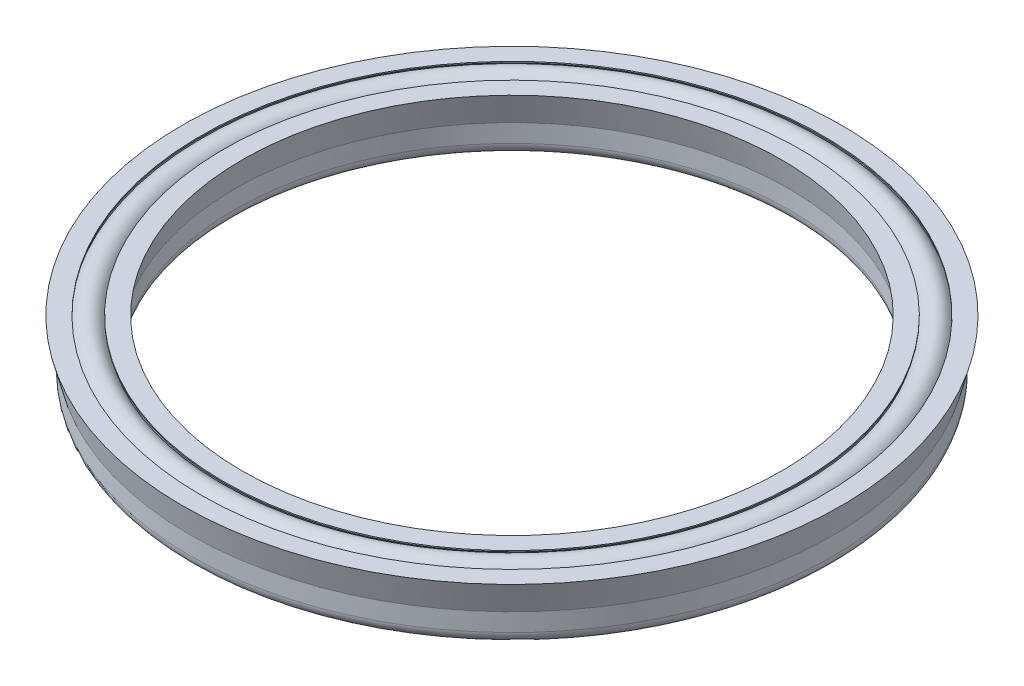
ISO-10303-21;
HEADER;
FILE_DESCRIPTION(('STEP AP214'),'2;1');
FILE_NAME('part.step','',(''),(''),'','','');
FILE_SCHEMA(('AUTOMOTIVE_DESIGN { 1 0 10303 214 1 1 1 1 }'));
ENDSEC;
DATA;
#1=APPLICATION_CONTEXT('core data for automotive mechanical design processes');
#2=APPLICATION_PROTOCOL_DEFINITION('international standard','automotive_design',2000,#1);
#3=PRODUCT_CONTEXT('',#1,'mechanical');
#4=PRODUCT('Part','Part','',(#3));
#5=PRODUCT_RELATED_PRODUCT_CATEGORY('part','',(#4));
#6=PRODUCT_DEFINITION_FORMATION('','',#4);
#7=PRODUCT_DEFINITION_CONTEXT('part definition',#1,'design');
#8=PRODUCT_DEFINITION('design','',#6,#7);
#9=PRODUCT_DEFINITION_SHAPE('','',#8);
#10=(LENGTH_UNIT() NAMED_UNIT(*) SI_UNIT(.MILLI.,.METRE.));
#11=(NAMED_UNIT(*) PLANE_ANGLE_UNIT() SI_UNIT($,.RADIAN.));
#12=(NAMED_UNIT(*) SI_UNIT($,.STERADIAN.) SOLID_ANGLE_UNIT());
#13=UNCERTAINTY_MEASURE_WITH_UNIT(LENGTH_MEASURE(1.E-05),#10,'distance_accuracy_value','');
#14=(GEOMETRIC_REPRESENTATION_CONTEXT(3) GLOBAL_UNCERTAINTY_ASSIGNED_CONTEXT((#13)) GLOBAL_UNIT_ASSIGNED_CONTEXT((#10,
#11,#12)) REPRESENTATION_CONTEXT('',''));
#15=CARTESIAN_POINT('',(0.,0.,0.));
#16=DIRECTION('',(0.,0.,1.));
#17=DIRECTION('',(1.,0.,0.));
#18=AXIS2_PLACEMENT_3D('',#15,#16,#17);
#19=CARTESIAN_POINT('',(0.,-1.13607096486153,0.));
#20=DIRECTION('',(0.,1.,0.));
#21=DIRECTION('',(0.,0.,1.));
#22=AXIS2_PLACEMENT_3D('',#19,#20,#21);
#23=TOROIDAL_SURFACE('',#22,31.7499950745616,1.4684352219848);
#24=CARTESIAN_POINT('',(0.,-1.13607096486153,33.2184302965464));
#25=VERTEX_POINT('',#24);
#26=VERTEX_LOOP('',#25);
#27=FACE_BOUND('',#26,.T.);
#28=ADVANCED_FACE('F41',(#27),#23,.T.);
#29=CLOSED_SHELL('',(#28));
#30=MANIFOLD_SOLID_BREP('B2',#29);
#31=CARTESIAN_POINT('',(0.,0.,0.));
#32=DIRECTION('',(0.,1.,0.));
#33=DIRECTION('',(0.,0.,1.));
#34=AXIS2_PLACEMENT_3D('',#31,#32,#33);
#35=CONICAL_SURFACE('',#34,34.9249901491235,0.252741728912575);
#36=CARTESIAN_POINT('',(0.,-3.07339523217578,0.));
#37=DIRECTION('',(0.,1.,0.));
#38=DIRECTION('',(0.,0.,1.));
#39=AXIS2_PLACEMENT_3D('',#36,#37,#38);
#40=CIRCLE('',#39,34.131241380483);
#41=CARTESIAN_POINT('',(0.,-3.07339523217578,34.131241380483));
#42=VERTEX_POINT('',#41);
#43=EDGE_CURVE('E40',#42,#42,#40,.T.);
#44=ORIENTED_EDGE('',*,*,#43,.T.);
#45=EDGE_LOOP('',(#44));
#46=FACE_BOUND('',#45,.T.);
#47=CARTESIAN_POINT('',(0.,0.,0.));
#48=DIRECTION('',(0.,1.,0.));
#49=DIRECTION('',(0.,0.,1.));
#50=AXIS2_PLACEMENT_3D('',#47,#48,#49);
#51=CIRCLE('',#50,34.9249901491235);
#52=CARTESIAN_POINT('',(0.,0.,34.9249901491235));
#53=VERTEX_POINT('',#52);
#54=EDGE_CURVE('E96',#53,#53,#51,.T.);
#55=ORIENTED_EDGE('',*,*,#54,.F.);
#56=EDGE_LOOP('',(#55));
#57=FACE_BOUND('',#56,.T.);
#58=ADVANCED_FACE('F56',(#46,#57),#35,.T.);
#59=CARTESIAN_POINT('',(0.,0.,0.));
#60=DIRECTION('',(0.,1.,0.));
#61=DIRECTION('',(0.,0.,1.));
#62=AXIS2_PLACEMENT_3D('',#59,#60,#61);
#63=CYLINDRICAL_SURFACE('',#62,34.131241380483);
#64=CARTESIAN_POINT('',(0.,-4.9783922769128,0.));
#65=DIRECTION('',(0.,1.,0.));
#66=DIRECTION('',(0.,0.,1.));
#67=AXIS2_PLACEMENT_3D('',#64,#65,#66);
#68=CIRCLE('',#67,34.131241380483);
#69=CARTESIAN_POINT('',(0.,-4.9783922769128,34.131241380483));
#70=VERTEX_POINT('',#69);
#71=EDGE_CURVE('E62',#70,#70,#68,.T.);
#72=ORIENTED_EDGE('',*,*,#71,.T.);
#73=EDGE_LOOP('',(#72));
#74=FACE_BOUND('',#73,.T.);
#75=ORIENTED_EDGE('',*,*,#43,.F.);
#76=EDGE_LOOP('',(#75));
#77=FACE_BOUND('',#76,.T.);
#78=ADVANCED_FACE('F104',(#74,#77),#63,.T.);
#79=CARTESIAN_POINT('',(0.,-4.9783922769128,0.));
#80=DIRECTION('',(0.,1.,0.));
#81=DIRECTION('',(0.,0.,1.));
#82=AXIS2_PLACEMENT_3D('',#79,#80,#81);
#83=TOROIDAL_SURFACE('',#82,32.8612433506583,1.26999802982468);
#84=CARTESIAN_POINT('',(0.,-6.24839030673749,0.));
#85=DIRECTION('',(0.,1.,0.));
#86=DIRECTION('',(0.,0.,1.));
#87=AXIS2_PLACEMENT_3D('',#84,#85,#86);
#88=CIRCLE('',#87,32.8612433506583);
#89=CARTESIAN_POINT('',(0.,-6.24839030673749,32.8612433506583));
#90=VERTEX_POINT('',#89);
#91=EDGE_CURVE('E66',#90,#90,#88,.T.);
#92=ORIENTED_EDGE('',*,*,#91,.T.);
#93=EDGE_LOOP('',(#92));
#94=FACE_BOUND('',#93,.T.);
#95=ORIENTED_EDGE('',*,*,#71,.F.);
#96=EDGE_LOOP('',(#95));
#97=FACE_BOUND('',#96,.T.);
#98=ADVANCED_FACE('F108',(#94,#97),#83,.T.);
#99=CARTESIAN_POINT('',(-32.8612433506583,-6.24839030673749,0.));
#100=DIRECTION('',(0.,-1.,0.));
#101=DIRECTION('',(0.,0.,-1.));
#102=AXIS2_PLACEMENT_3D('',#99,#100,#101);
#103=PLANE('',#102);
#104=CARTESIAN_POINT('',(0.,-6.24839030673749,0.));
#105=DIRECTION('',(0.,1.,0.));
#106=DIRECTION('',(0.,0.,1.));
#107=AXIS2_PLACEMENT_3D('',#104,#105,#106);
#108=CIRCLE('',#107,30.6387467984652);
#109=CARTESIAN_POINT('',(0.,-6.24839030673749,30.6387467984652));
#110=VERTEX_POINT('',#109);
#111=EDGE_CURVE('E70',#110,#110,#108,.T.);
#112=ORIENTED_EDGE('',*,*,#111,.T.);
#113=EDGE_LOOP('',(#112));
#114=FACE_BOUND('',#113,.T.);
#115=ORIENTED_EDGE('',*,*,#91,.F.);
#116=EDGE_LOOP('',(#115));
#117=FACE_BOUND('',#116,.T.);
#118=ADVANCED_FACE('F112',(#114,#117),#103,.T.);
#119=CARTESIAN_POINT('',(0.,-4.97839227691282,0.));
#120=DIRECTION('',(0.,1.,0.));
#121=DIRECTION('',(0.,0.,1.));
#122=AXIS2_PLACEMENT_3D('',#119,#120,#121);
#123=TOROIDAL_SURFACE('',#122,30.6387467984652,1.26999802982467);
#124=CARTESIAN_POINT('',(0.,-4.97839227691282,0.));
#125=DIRECTION('',(0.,1.,0.));
#126=DIRECTION('',(0.,0.,1.));
#127=AXIS2_PLACEMENT_3D('',#124,#125,#126);
#128=CIRCLE('',#127,29.3687487686405);
#129=CARTESIAN_POINT('',(0.,-4.97839227691282,29.3687487686405));
#130=VERTEX_POINT('',#129);
#131=EDGE_CURVE('E75',#130,#130,#128,.T.);
#132=ORIENTED_EDGE('',*,*,#131,.T.);
#133=EDGE_LOOP('',(#132));
#134=FACE_BOUND('',#133,.T.);
#135=ORIENTED_EDGE('',*,*,#111,.F.);
#136=EDGE_LOOP('',(#135));
#137=FACE_BOUND('',#136,.T.);
#138=ADVANCED_FACE('F119',(#134,#137),#123,.T.);
#139=CARTESIAN_POINT('',(0.,0.,0.));
#140=DIRECTION('',(0.,1.,0.));
#141=DIRECTION('',(0.,0.,1.));
#142=AXIS2_PLACEMENT_3D('',#139,#140,#141);
#143=CYLINDRICAL_SURFACE('',#142,29.3687487686405);
#144=CARTESIAN_POINT('',(0.,-3.0733952321758,0.));
#145=DIRECTION('',(0.,1.,0.));
#146=DIRECTION('',(0.,0.,1.));
#147=AXIS2_PLACEMENT_3D('',#144,#145,#146);
#148=CIRCLE('',#147,29.3687487686405);
#149=CARTESIAN_POINT('',(0.,-3.0733952321758,29.3687487686405));
#150=VERTEX_POINT('',#149);
#151=EDGE_CURVE('E78',#150,#150,#148,.T.);
#152=ORIENTED_EDGE('',*,*,#151,.T.);
#153=EDGE_LOOP('',(#152));
#154=FACE_BOUND('',#153,.T.);
#155=ORIENTED_EDGE('',*,*,#131,.F.);
#156=EDGE_LOOP('',(#155));
#157=FACE_BOUND('',#156,.T.);
#158=ADVANCED_FACE('F123',(#154,#157),#143,.F.);
#159=CARTESIAN_POINT('',(0.,-3.0733952321758,0.));
#160=DIRECTION('',(0.,-1.,0.));
#161=DIRECTION('',(0.,0.,-1.));
#162=AXIS2_PLACEMENT_3D('',#159,#160,#161);
#163=CONICAL_SURFACE('',#162,29.3687487686405,0.252741728912592);
#164=CARTESIAN_POINT('',(0.,0.,0.));
#165=DIRECTION('',(0.,1.,0.));
#166=DIRECTION('',(0.,0.,1.));
#167=AXIS2_PLACEMENT_3D('',#164,#165,#166);
#168=CIRCLE('',#167,28.575);
#169=CARTESIAN_POINT('',(0.,0.,28.575));
#170=VERTEX_POINT('',#169);
#171=EDGE_CURVE('E81',#170,#170,#168,.T.);
#172=ORIENTED_EDGE('',*,*,#171,.T.);
#173=EDGE_LOOP('',(#172));
#174=FACE_BOUND('',#173,.T.);
#175=ORIENTED_EDGE('',*,*,#151,.F.);
#176=EDGE_LOOP('',(#175));
#177=FACE_BOUND('',#176,.T.);
#178=ADVANCED_FACE('F127',(#174,#177),#163,.F.);
#179=CARTESIAN_POINT('',(-30.5288431228071,0.,0.));
#180=DIRECTION('',(0.,1.,0.));
#181=DIRECTION('',(0.,0.,1.));
#182=AXIS2_PLACEMENT_3D('',#179,#180,#181);
#183=PLANE('',#182);
#184=CARTESIAN_POINT('',(0.,0.,0.));
#185=DIRECTION('',(0.,1.,0.));
#186=DIRECTION('',(0.,0.,1.));
#187=AXIS2_PLACEMENT_3D('',#184,#185,#186);
#188=CIRCLE('',#187,30.5288431228071);
#189=CARTESIAN_POINT('',(0.,0.,30.5288431228071));
#190=VERTEX_POINT('',#189);
#191=EDGE_CURVE('E84',#190,#190,#188,.T.);
#192=ORIENTED_EDGE('',*,*,#191,.T.);
#193=EDGE_LOOP('',(#192));
#194=FACE_BOUND('',#193,.T.);
#195=ORIENTED_EDGE('',*,*,#171,.F.);
#196=EDGE_LOOP('',(#195));
#197=FACE_BOUND('',#196,.T.);
#198=ADVANCED_FACE('F131',(#194,#197),#183,.T.);
#199=CARTESIAN_POINT('',(0.,0.,0.));
#200=DIRECTION('',(0.,1.,0.));
#201=DIRECTION('',(0.,0.,1.));
#202=AXIS2_PLACEMENT_3D('',#199,#200,#201);
#203=CYLINDRICAL_SURFACE('',#202,30.5288431228071);
#204=CARTESIAN_POINT('',(0.,-0.121705970592285,0.));
#205=DIRECTION('',(0.,1.,0.));
#206=DIRECTION('',(0.,0.,1.));
#207=AXIS2_PLACEMENT_3D('',#204,#205,#206);
#208=CIRCLE('',#207,30.5288431228071);
#209=CARTESIAN_POINT('',(0.,-0.121705970592285,30.5288431228071));
#210=VERTEX_POINT('',#209);
#211=EDGE_CURVE('E87',#210,#210,#208,.T.);
#212=ORIENTED_EDGE('',*,*,#211,.T.);
#213=EDGE_LOOP('',(#212));
#214=FACE_BOUND('',#213,.T.);
#215=ORIENTED_EDGE('',*,*,#191,.F.);
#216=EDGE_LOOP('',(#215));
#217=FACE_BOUND('',#216,.T.);
#218=ADVANCED_FACE('F135',(#214,#217),#203,.T.);
#219=CARTESIAN_POINT('',(0.,-1.13607096486153,0.));
#220=DIRECTION('',(0.,1.,0.));
#221=DIRECTION('',(0.,0.,1.));
#222=AXIS2_PLACEMENT_3D('',#219,#220,#221);
#223=TOROIDAL_SURFACE('',#222,31.7499950745616,1.58749753728087);
#224=CARTESIAN_POINT('',(0.,-0.121705970592222,0.));
#225=DIRECTION('',(0.,1.,0.));
#226=DIRECTION('',(0.,0.,1.));
#227=AXIS2_PLACEMENT_3D('',#224,#225,#226);
#228=CIRCLE('',#227,32.9711470263161);
#229=CARTESIAN_POINT('',(0.,-0.121705970592222,32.9711470263161));
#230=VERTEX_POINT('',#229);
#231=EDGE_CURVE('E90',#230,#230,#228,.T.);
#232=ORIENTED_EDGE('',*,*,#231,.T.);
#233=EDGE_LOOP('',(#232));
#234=FACE_BOUND('',#233,.T.);
#235=ORIENTED_EDGE('',*,*,#211,.F.);
#236=EDGE_LOOP('',(#235));
#237=FACE_BOUND('',#236,.T.);
#238=ADVANCED_FACE('F139',(#234,#237),#223,.F.);
#239=CARTESIAN_POINT('',(0.,0.,0.));
#240=DIRECTION('',(0.,1.,0.));
#241=DIRECTION('',(0.,0.,1.));
#242=AXIS2_PLACEMENT_3D('',#239,#240,#241);
#243=CYLINDRICAL_SURFACE('',#242,32.9711470263161);
#244=CARTESIAN_POINT('',(0.,0.,0.));
#245=DIRECTION('',(0.,1.,0.));
#246=DIRECTION('',(0.,0.,1.));
#247=AXIS2_PLACEMENT_3D('',#244,#245,#246);
#248=CIRCLE('',#247,32.9711470263161);
#249=CARTESIAN_POINT('',(0.,0.,32.9711470263161));
#250=VERTEX_POINT('',#249);
#251=EDGE_CURVE('E93',#250,#250,#248,.T.);
#252=ORIENTED_EDGE('',*,*,#251,.T.);
#253=EDGE_LOOP('',(#252));
#254=FACE_BOUND('',#253,.T.);
#255=ORIENTED_EDGE('',*,*,#231,.F.);
#256=EDGE_LOOP('',(#255));
#257=FACE_BOUND('',#256,.T.);
#258=ADVANCED_FACE('F143',(#254,#257),#243,.F.);
#259=CARTESIAN_POINT('',(-34.9249901491235,0.,0.));
#260=DIRECTION('',(0.,1.,0.));
#261=DIRECTION('',(0.,0.,1.));
#262=AXIS2_PLACEMENT_3D('',#259,#260,#261);
#263=PLANE('',#262);
#264=ORIENTED_EDGE('',*,*,#54,.T.);
#265=EDGE_LOOP('',(#264));
#266=FACE_BOUND('',#265,.T.);
#267=ORIENTED_EDGE('',*,*,#251,.F.);
#268=EDGE_LOOP('',(#267));
#269=FACE_BOUND('',#268,.T.);
#270=ADVANCED_FACE('F100',(#266,#269),#263,.T.);
#271=CLOSED_SHELL('',(#58,#78,#98,#118,#138,#158,#178,#198,#218,#238,#258,#270));
#272=MANIFOLD_SOLID_BREP('B6',#271);
#273=ADVANCED_BREP_SHAPE_REPRESENTATION('',(#18,#30,#272),#14);
#274=SHAPE_DEFINITION_REPRESENTATION(#9,#273);
ENDSEC;
END-ISO-10303-21;
